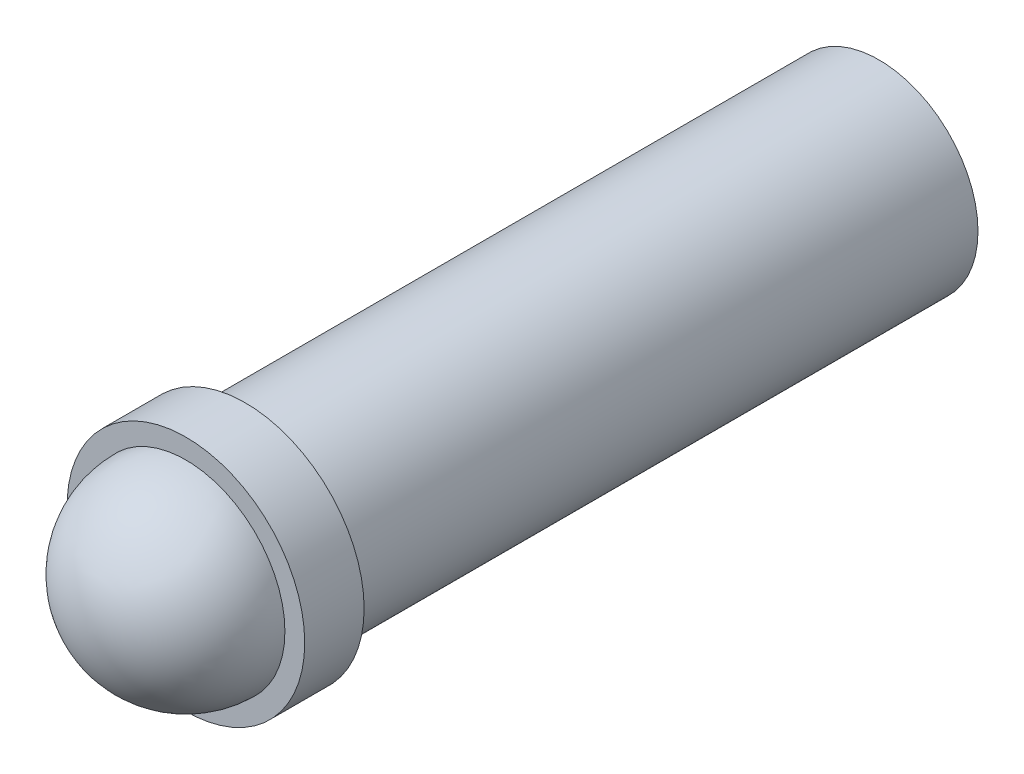
ISO-10303-21;
HEADER;
FILE_DESCRIPTION(('STEP AP214'),'2;1');
FILE_NAME('part.step','',(''),(''),'','','');
FILE_SCHEMA(('AUTOMOTIVE_DESIGN { 1 0 10303 214 1 1 1 1 }'));
ENDSEC;
DATA;
#1=APPLICATION_CONTEXT('core data for automotive mechanical design processes');
#2=APPLICATION_PROTOCOL_DEFINITION('international standard','automotive_design',2000,#1);
#3=PRODUCT_CONTEXT('',#1,'mechanical');
#4=PRODUCT('Part','Part','',(#3));
#5=PRODUCT_RELATED_PRODUCT_CATEGORY('part','',(#4));
#6=PRODUCT_DEFINITION_FORMATION('','',#4);
#7=PRODUCT_DEFINITION_CONTEXT('part definition',#1,'design');
#8=PRODUCT_DEFINITION('design','',#6,#7);
#9=PRODUCT_DEFINITION_SHAPE('','',#8);
#10=(LENGTH_UNIT() NAMED_UNIT(*) SI_UNIT(.MILLI.,.METRE.));
#11=(NAMED_UNIT(*) PLANE_ANGLE_UNIT() SI_UNIT($,.RADIAN.));
#12=(NAMED_UNIT(*) SI_UNIT($,.STERADIAN.) SOLID_ANGLE_UNIT());
#13=UNCERTAINTY_MEASURE_WITH_UNIT(LENGTH_MEASURE(1.E-05),#10,'distance_accuracy_value','');
#14=(GEOMETRIC_REPRESENTATION_CONTEXT(3) GLOBAL_UNCERTAINTY_ASSIGNED_CONTEXT((#13)) GLOBAL_UNIT_ASSIGNED_CONTEXT((#10,
#11,#12)) REPRESENTATION_CONTEXT('',''));
#15=CARTESIAN_POINT('',(0.,0.,0.));
#16=DIRECTION('',(0.,0.,1.));
#17=DIRECTION('',(1.,0.,0.));
#18=AXIS2_PLACEMENT_3D('',#15,#16,#17);
#19=CARTESIAN_POINT('',(0.,0.,80.));
#20=DIRECTION('',(0.,0.,-1.));
#21=DIRECTION('',(-1.,0.,0.));
#22=AXIS2_PLACEMENT_3D('',#19,#20,#21);
#23=CYLINDRICAL_SURFACE('',#22,10.);
#24=CARTESIAN_POINT('',(0.,0.,0.));
#25=DIRECTION('',(0.,0.,1.));
#26=DIRECTION('',(1.,0.,0.));
#27=AXIS2_PLACEMENT_3D('',#24,#25,#26);
#28=CIRCLE('',#27,10.);
#29=CARTESIAN_POINT('',(10.,0.,0.));
#30=VERTEX_POINT('',#29);
#31=EDGE_CURVE('E48',#30,#30,#28,.T.);
#32=ORIENTED_EDGE('',*,*,#31,.T.);
#33=EDGE_LOOP('',(#32));
#34=FACE_BOUND('',#33,.T.);
#35=CARTESIAN_POINT('',(0.,0.,64.));
#36=DIRECTION('',(0.,0.,1.));
#37=DIRECTION('',(1.,0.,0.));
#38=AXIS2_PLACEMENT_3D('',#35,#36,#37);
#39=CIRCLE('',#38,10.);
#40=CARTESIAN_POINT('',(10.,0.,64.));
#41=VERTEX_POINT('',#40);
#42=EDGE_CURVE('E10',#41,#41,#39,.T.);
#43=ORIENTED_EDGE('',*,*,#42,.F.);
#44=EDGE_LOOP('',(#43));
#45=FACE_BOUND('',#44,.T.);
#46=ADVANCED_FACE('F40',(#34,#45),#23,.T.);
#47=CARTESIAN_POINT('',(0.,0.,0.));
#48=DIRECTION('',(0.,0.,1.));
#49=DIRECTION('',(1.,0.,0.));
#50=AXIS2_PLACEMENT_3D('',#47,#48,#49);
#51=PLANE('',#50);
#52=ORIENTED_EDGE('',*,*,#31,.F.);
#53=EDGE_LOOP('',(#52));
#54=FACE_BOUND('',#53,.T.);
#55=ADVANCED_FACE('F73',(#54),#51,.F.);
#56=CARTESIAN_POINT('',(0.,0.,70.));
#57=DIRECTION('',(0.,0.,1.));
#58=DIRECTION('',(1.,0.,0.));
#59=AXIS2_PLACEMENT_3D('',#56,#57,#58);
#60=PLANE('',#59);
#61=CARTESIAN_POINT('',(0.,0.,70.));
#62=DIRECTION('',(0.,0.,1.));
#63=DIRECTION('',(1.,0.,0.));
#64=AXIS2_PLACEMENT_3D('',#61,#62,#63);
#65=CIRCLE('',#64,12.);
#66=CARTESIAN_POINT('',(12.,0.,70.));
#67=VERTEX_POINT('',#66);
#68=EDGE_CURVE('E55',#67,#67,#65,.T.);
#69=ORIENTED_EDGE('',*,*,#68,.T.);
#70=EDGE_LOOP('',(#69));
#71=FACE_BOUND('',#70,.T.);
#72=CARTESIAN_POINT('',(0.,0.,70.));
#73=DIRECTION('',(0.,0.,-1.));
#74=DIRECTION('',(-1.,0.,0.));
#75=AXIS2_PLACEMENT_3D('',#72,#73,#74);
#76=CIRCLE('',#75,10.);
#77=CARTESIAN_POINT('',(-10.,0.,70.));
#78=VERTEX_POINT('',#77);
#79=EDGE_CURVE('E42',#78,#78,#76,.T.);
#80=ORIENTED_EDGE('',*,*,#79,.T.);
#81=EDGE_LOOP('',(#80));
#82=FACE_BOUND('',#81,.T.);
#83=ADVANCED_FACE('F61',(#71,#82),#60,.T.);
#84=CARTESIAN_POINT('',(0.,0.,64.));
#85=DIRECTION('',(0.,0.,1.));
#86=DIRECTION('',(1.,0.,0.));
#87=AXIS2_PLACEMENT_3D('',#84,#85,#86);
#88=PLANE('',#87);
#89=CARTESIAN_POINT('',(0.,0.,64.));
#90=DIRECTION('',(0.,0.,1.));
#91=DIRECTION('',(1.,0.,0.));
#92=AXIS2_PLACEMENT_3D('',#89,#90,#91);
#93=CIRCLE('',#92,12.);
#94=CARTESIAN_POINT('',(12.,0.,64.));
#95=VERTEX_POINT('',#94);
#96=EDGE_CURVE('E54',#95,#95,#93,.T.);
#97=ORIENTED_EDGE('',*,*,#96,.F.);
#98=EDGE_LOOP('',(#97));
#99=FACE_BOUND('',#98,.T.);
#100=ORIENTED_EDGE('',*,*,#42,.T.);
#101=EDGE_LOOP('',(#100));
#102=FACE_BOUND('',#101,.T.);
#103=ADVANCED_FACE('F68',(#99,#102),#88,.F.);
#104=CARTESIAN_POINT('',(0.,0.,70.));
#105=DIRECTION('',(0.,0.,-1.));
#106=DIRECTION('',(-1.,0.,0.));
#107=AXIS2_PLACEMENT_3D('',#104,#105,#106);
#108=CYLINDRICAL_SURFACE('',#107,12.);
#109=ORIENTED_EDGE('',*,*,#68,.F.);
#110=EDGE_LOOP('',(#109));
#111=FACE_BOUND('',#110,.T.);
#112=ORIENTED_EDGE('',*,*,#96,.T.);
#113=EDGE_LOOP('',(#112));
#114=FACE_BOUND('',#113,.T.);
#115=ADVANCED_FACE('F64',(#111,#114),#108,.T.);
#116=CARTESIAN_POINT('',(0.,0.,70.));
#117=DIRECTION('',(0.,0.,1.));
#118=DIRECTION('',(1.,0.,0.));
#119=AXIS2_PLACEMENT_3D('',#116,#117,#118);
#120=SPHERICAL_SURFACE('',#119,10.);
#121=ORIENTED_EDGE('',*,*,#79,.F.);
#122=EDGE_LOOP('',(#121));
#123=FACE_BOUND('',#122,.T.);
#124=ADVANCED_FACE('F39',(#123),#120,.T.);
#125=CLOSED_SHELL('',(#46,#55,#83,#103,#115,#124));
#126=MANIFOLD_SOLID_BREP('B2',#125);
#127=ADVANCED_BREP_SHAPE_REPRESENTATION('',(#18,#126),#14);
#128=SHAPE_DEFINITION_REPRESENTATION(#9,#127);
ENDSEC;
END-ISO-10303-21;
